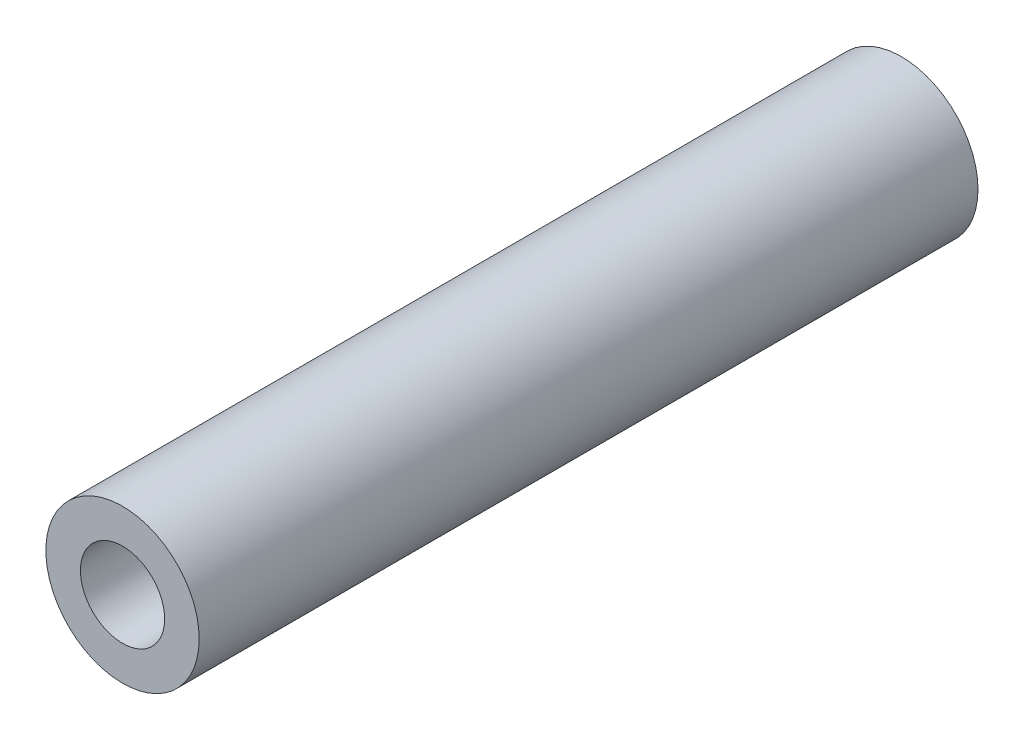
ISO-10303-21;
HEADER;
FILE_DESCRIPTION(('STEP AP214'),'2;1');
FILE_NAME('part.step','',(''),(''),'','','');
FILE_SCHEMA(('AUTOMOTIVE_DESIGN { 1 0 10303 214 1 1 1 1 }'));
ENDSEC;
DATA;
#1=APPLICATION_CONTEXT('core data for automotive mechanical design processes');
#2=APPLICATION_PROTOCOL_DEFINITION('international standard','automotive_design',2000,#1);
#3=PRODUCT_CONTEXT('',#1,'mechanical');
#4=PRODUCT('Part','Part','',(#3));
#5=PRODUCT_RELATED_PRODUCT_CATEGORY('part','',(#4));
#6=PRODUCT_DEFINITION_FORMATION('','',#4);
#7=PRODUCT_DEFINITION_CONTEXT('part definition',#1,'design');
#8=PRODUCT_DEFINITION('design','',#6,#7);
#9=PRODUCT_DEFINITION_SHAPE('','',#8);
#10=(LENGTH_UNIT() NAMED_UNIT(*) SI_UNIT(.MILLI.,.METRE.));
#11=(NAMED_UNIT(*) PLANE_ANGLE_UNIT() SI_UNIT($,.RADIAN.));
#12=(NAMED_UNIT(*) SI_UNIT($,.STERADIAN.) SOLID_ANGLE_UNIT());
#13=UNCERTAINTY_MEASURE_WITH_UNIT(LENGTH_MEASURE(1.E-05),#10,'distance_accuracy_value','');
#14=(GEOMETRIC_REPRESENTATION_CONTEXT(3) GLOBAL_UNCERTAINTY_ASSIGNED_CONTEXT((#13)) GLOBAL_UNIT_ASSIGNED_CONTEXT((#10,
#11,#12)) REPRESENTATION_CONTEXT('',''));
#15=CARTESIAN_POINT('',(0.,0.,0.));
#16=DIRECTION('',(0.,0.,1.));
#17=DIRECTION('',(1.,0.,0.));
#18=AXIS2_PLACEMENT_3D('',#15,#16,#17);
#19=CARTESIAN_POINT('',(0.,0.,48.377348));
#20=DIRECTION('',(0.,0.,-1.));
#21=DIRECTION('',(-1.,0.,0.));
#22=AXIS2_PLACEMENT_3D('',#19,#20,#21);
#23=CYLINDRICAL_SURFACE('',#22,4.7625);
#24=CARTESIAN_POINT('',(0.,0.,48.377348));
#25=DIRECTION('',(0.,0.,1.));
#26=DIRECTION('',(1.,0.,0.));
#27=AXIS2_PLACEMENT_3D('',#24,#25,#26);
#28=CIRCLE('',#27,4.7625);
#29=CARTESIAN_POINT('',(4.7625,0.,48.377348));
#30=VERTEX_POINT('',#29);
#31=EDGE_CURVE('E10',#30,#30,#28,.T.);
#32=ORIENTED_EDGE('',*,*,#31,.F.);
#33=EDGE_LOOP('',(#32));
#34=FACE_BOUND('',#33,.T.);
#35=CARTESIAN_POINT('',(0.,0.,0.));
#36=DIRECTION('',(0.,0.,1.));
#37=DIRECTION('',(1.,0.,0.));
#38=AXIS2_PLACEMENT_3D('',#35,#36,#37);
#39=CIRCLE('',#38,4.7625);
#40=CARTESIAN_POINT('',(4.7625,0.,0.));
#41=VERTEX_POINT('',#40);
#42=EDGE_CURVE('E18',#41,#41,#39,.T.);
#43=ORIENTED_EDGE('',*,*,#42,.T.);
#44=EDGE_LOOP('',(#43));
#45=FACE_BOUND('',#44,.T.);
#46=ADVANCED_FACE('F15',(#34,#45),#23,.T.);
#47=CARTESIAN_POINT('',(0.,0.,48.377348));
#48=DIRECTION('',(0.,0.,1.));
#49=DIRECTION('',(1.,0.,0.));
#50=AXIS2_PLACEMENT_3D('',#47,#48,#49);
#51=PLANE('',#50);
#52=CARTESIAN_POINT('',(0.,0.,48.377348));
#53=DIRECTION('',(0.,0.,1.));
#54=DIRECTION('',(1.,0.,0.));
#55=AXIS2_PLACEMENT_3D('',#52,#53,#54);
#56=CIRCLE('',#55,2.6162);
#57=CARTESIAN_POINT('',(2.6162,0.,48.377348));
#58=VERTEX_POINT('',#57);
#59=EDGE_CURVE('E34',#58,#58,#56,.T.);
#60=ORIENTED_EDGE('',*,*,#59,.F.);
#61=EDGE_LOOP('',(#60));
#62=FACE_BOUND('',#61,.T.);
#63=ORIENTED_EDGE('',*,*,#31,.T.);
#64=EDGE_LOOP('',(#63));
#65=FACE_BOUND('',#64,.T.);
#66=ADVANCED_FACE('F40',(#62,#65),#51,.T.);
#67=CARTESIAN_POINT('',(0.,0.,0.));
#68=DIRECTION('',(0.,0.,1.));
#69=DIRECTION('',(1.,0.,0.));
#70=AXIS2_PLACEMENT_3D('',#67,#68,#69);
#71=PLANE('',#70);
#72=CARTESIAN_POINT('',(0.,0.,0.));
#73=DIRECTION('',(0.,0.,1.));
#74=DIRECTION('',(1.,0.,0.));
#75=AXIS2_PLACEMENT_3D('',#72,#73,#74);
#76=CIRCLE('',#75,2.6162);
#77=CARTESIAN_POINT('',(2.6162,0.,0.));
#78=VERTEX_POINT('',#77);
#79=EDGE_CURVE('E29',#78,#78,#76,.F.);
#80=ORIENTED_EDGE('',*,*,#79,.F.);
#81=EDGE_LOOP('',(#80));
#82=FACE_BOUND('',#81,.T.);
#83=ORIENTED_EDGE('',*,*,#42,.F.);
#84=EDGE_LOOP('',(#83));
#85=FACE_BOUND('',#84,.T.);
#86=ADVANCED_FACE('F42',(#82,#85),#71,.F.);
#87=CARTESIAN_POINT('',(0.,0.,-0.002000000000002));
#88=DIRECTION('',(0.,0.,1.));
#89=DIRECTION('',(1.,0.,0.));
#90=AXIS2_PLACEMENT_3D('',#87,#88,#89);
#91=CYLINDRICAL_SURFACE('',#90,2.6162);
#92=ORIENTED_EDGE('',*,*,#79,.T.);
#93=EDGE_LOOP('',(#92));
#94=FACE_BOUND('',#93,.T.);
#95=ORIENTED_EDGE('',*,*,#59,.T.);
#96=EDGE_LOOP('',(#95));
#97=FACE_BOUND('',#96,.T.);
#98=ADVANCED_FACE('F38',(#94,#97),#91,.F.);
#99=CLOSED_SHELL('',(#46,#66,#86,#98));
#100=MANIFOLD_SOLID_BREP('B1',#99);
#101=ADVANCED_BREP_SHAPE_REPRESENTATION('',(#18,#100),#14);
#102=SHAPE_DEFINITION_REPRESENTATION(#9,#101);
ENDSEC;
END-ISO-10303-21;
